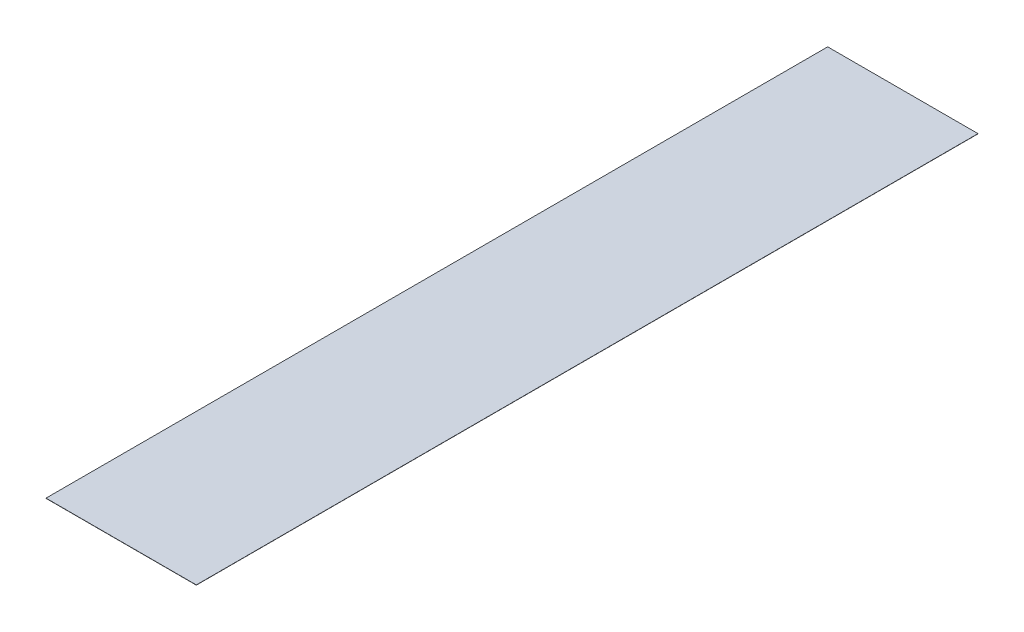
ISO-10303-21;
HEADER;
FILE_DESCRIPTION(('STEP AP214'),'2;1');
FILE_NAME('part.step','',(''),(''),'','','');
FILE_SCHEMA(('AUTOMOTIVE_DESIGN { 1 0 10303 214 1 1 1 1 }'));
ENDSEC;
DATA;
#1=APPLICATION_CONTEXT('core data for automotive mechanical design processes');
#2=APPLICATION_PROTOCOL_DEFINITION('international standard','automotive_design',2000,#1);
#3=PRODUCT_CONTEXT('',#1,'mechanical');
#4=PRODUCT('Part','Part','',(#3));
#5=PRODUCT_RELATED_PRODUCT_CATEGORY('part','',(#4));
#6=PRODUCT_DEFINITION_FORMATION('','',#4);
#7=PRODUCT_DEFINITION_CONTEXT('part definition',#1,'design');
#8=PRODUCT_DEFINITION('design','',#6,#7);
#9=PRODUCT_DEFINITION_SHAPE('','',#8);
#10=(LENGTH_UNIT() NAMED_UNIT(*) SI_UNIT(.MILLI.,.METRE.));
#11=(NAMED_UNIT(*) PLANE_ANGLE_UNIT() SI_UNIT($,.RADIAN.));
#12=(NAMED_UNIT(*) SI_UNIT($,.STERADIAN.) SOLID_ANGLE_UNIT());
#13=UNCERTAINTY_MEASURE_WITH_UNIT(LENGTH_MEASURE(1.E-05),#10,'distance_accuracy_value','');
#14=(GEOMETRIC_REPRESENTATION_CONTEXT(3) GLOBAL_UNCERTAINTY_ASSIGNED_CONTEXT((#13)) GLOBAL_UNIT_ASSIGNED_CONTEXT((#10,
#11,#12)) REPRESENTATION_CONTEXT('',''));
#15=CARTESIAN_POINT('',(0.,0.,0.));
#16=DIRECTION('',(0.,0.,1.));
#17=DIRECTION('',(1.,0.,0.));
#18=AXIS2_PLACEMENT_3D('',#15,#16,#17);
#19=CARTESIAN_POINT('',(0.,6.35,0.));
#20=DIRECTION('',(0.,1.,0.));
#21=DIRECTION('',(0.,0.,1.));
#22=AXIS2_PLACEMENT_3D('',#19,#20,#21);
#23=PLANE('',#22);
#24=DIRECTION('',(-1.,0.,0.));
#25=VECTOR('',#24,1.);
#26=CARTESIAN_POINT('',(2286.,6.35,-11887.2));
#27=LINE('',#26,#25);
#28=CARTESIAN_POINT('',(-2286.,6.35,-11887.2));
#29=VERTEX_POINT('',#28);
#30=CARTESIAN_POINT('',(2286.,6.35,-11887.2));
#31=VERTEX_POINT('',#30);
#32=EDGE_CURVE('E66',#29,#31,#27,.F.);
#33=ORIENTED_EDGE('',*,*,#32,.F.);
#34=DIRECTION('',(0.,0.,1.));
#35=VECTOR('',#34,1.);
#36=CARTESIAN_POINT('',(-2286.,6.35,-11887.2));
#37=LINE('',#36,#35);
#38=CARTESIAN_POINT('',(-2286.,6.35,11887.2));
#39=VERTEX_POINT('',#38);
#40=EDGE_CURVE('E18',#39,#29,#37,.F.);
#41=ORIENTED_EDGE('',*,*,#40,.F.);
#42=DIRECTION('',(1.,0.,0.));
#43=VECTOR('',#42,1.);
#44=CARTESIAN_POINT('',(-2286.,6.35,11887.2));
#45=LINE('',#44,#43);
#46=CARTESIAN_POINT('',(2286.,6.35,11887.2));
#47=VERTEX_POINT('',#46);
#48=EDGE_CURVE('E56',#47,#39,#45,.F.);
#49=ORIENTED_EDGE('',*,*,#48,.F.);
#50=DIRECTION('',(0.,0.,-1.));
#51=VECTOR('',#50,1.);
#52=CARTESIAN_POINT('',(2286.,6.35,11887.2));
#53=LINE('',#52,#51);
#54=EDGE_CURVE('E51',#31,#47,#53,.F.);
#55=ORIENTED_EDGE('',*,*,#54,.F.);
#56=EDGE_LOOP('',(#33,#41,#49,#55));
#57=FACE_BOUND('',#56,.T.);
#58=ADVANCED_FACE('F15',(#57),#23,.T.);
#59=CARTESIAN_POINT('',(-2286.,0.,-11887.2));
#60=DIRECTION('',(-1.,0.,0.));
#61=DIRECTION('',(0.,0.,1.));
#62=AXIS2_PLACEMENT_3D('',#59,#60,#61);
#63=PLANE('',#62);
#64=DIRECTION('',(0.,1.,0.));
#65=VECTOR('',#64,1.);
#66=CARTESIAN_POINT('',(-2286.,0.,-11887.2));
#67=LINE('',#66,#65);
#68=CARTESIAN_POINT('',(-2286.,0.,-11887.2));
#69=VERTEX_POINT('',#68);
#70=EDGE_CURVE('E77',#69,#29,#67,.T.);
#71=ORIENTED_EDGE('',*,*,#70,.F.);
#72=DIRECTION('',(0.,0.,1.));
#73=VECTOR('',#72,1.);
#74=CARTESIAN_POINT('',(-2286.,0.,0.));
#75=LINE('',#74,#73);
#76=CARTESIAN_POINT('',(-2286.,0.,11887.2));
#77=VERTEX_POINT('',#76);
#78=EDGE_CURVE('E72',#69,#77,#75,.T.);
#79=ORIENTED_EDGE('',*,*,#78,.T.);
#80=DIRECTION('',(0.,1.,0.));
#81=VECTOR('',#80,1.);
#82=CARTESIAN_POINT('',(-2286.,0.,11887.2));
#83=LINE('',#82,#81);
#84=EDGE_CURVE('E61',#39,#77,#83,.F.);
#85=ORIENTED_EDGE('',*,*,#84,.F.);
#86=ORIENTED_EDGE('',*,*,#40,.T.);
#87=EDGE_LOOP('',(#71,#79,#85,#86));
#88=FACE_BOUND('',#87,.T.);
#89=ADVANCED_FACE('F71',(#88),#63,.T.);
#90=CARTESIAN_POINT('',(-2286.,0.,11887.2));
#91=DIRECTION('',(0.,0.,1.));
#92=DIRECTION('',(1.,0.,0.));
#93=AXIS2_PLACEMENT_3D('',#90,#91,#92);
#94=PLANE('',#93);
#95=ORIENTED_EDGE('',*,*,#84,.T.);
#96=DIRECTION('',(1.,0.,0.));
#97=VECTOR('',#96,1.);
#98=CARTESIAN_POINT('',(0.,0.,11887.2));
#99=LINE('',#98,#97);
#100=CARTESIAN_POINT('',(2286.,0.,11887.2));
#101=VERTEX_POINT('',#100);
#102=EDGE_CURVE('E82',#77,#101,#99,.T.);
#103=ORIENTED_EDGE('',*,*,#102,.T.);
#104=DIRECTION('',(0.,1.,0.));
#105=VECTOR('',#104,1.);
#106=CARTESIAN_POINT('',(2286.,0.,11887.2));
#107=LINE('',#106,#105);
#108=EDGE_CURVE('E63',#47,#101,#107,.F.);
#109=ORIENTED_EDGE('',*,*,#108,.F.);
#110=ORIENTED_EDGE('',*,*,#48,.T.);
#111=EDGE_LOOP('',(#95,#103,#109,#110));
#112=FACE_BOUND('',#111,.T.);
#113=ADVANCED_FACE('F58',(#112),#94,.T.);
#114=CARTESIAN_POINT('',(2286.,0.,11887.2));
#115=DIRECTION('',(1.,0.,0.));
#116=DIRECTION('',(0.,0.,-1.));
#117=AXIS2_PLACEMENT_3D('',#114,#115,#116);
#118=PLANE('',#117);
#119=ORIENTED_EDGE('',*,*,#108,.T.);
#120=DIRECTION('',(0.,0.,1.));
#121=VECTOR('',#120,1.);
#122=CARTESIAN_POINT('',(2286.,0.,0.));
#123=LINE('',#122,#121);
#124=CARTESIAN_POINT('',(2286.,0.,-11887.2));
#125=VERTEX_POINT('',#124);
#126=EDGE_CURVE('E24',#101,#125,#123,.F.);
#127=ORIENTED_EDGE('',*,*,#126,.T.);
#128=DIRECTION('',(0.,1.,0.));
#129=VECTOR('',#128,1.);
#130=CARTESIAN_POINT('',(2286.,0.,-11887.2));
#131=LINE('',#130,#129);
#132=EDGE_CURVE('E32',#31,#125,#131,.F.);
#133=ORIENTED_EDGE('',*,*,#132,.F.);
#134=ORIENTED_EDGE('',*,*,#54,.T.);
#135=EDGE_LOOP('',(#119,#127,#133,#134));
#136=FACE_BOUND('',#135,.T.);
#137=ADVANCED_FACE('F86',(#136),#118,.T.);
#138=CARTESIAN_POINT('',(2286.,0.,-11887.2));
#139=DIRECTION('',(0.,0.,-1.));
#140=DIRECTION('',(-1.,0.,0.));
#141=AXIS2_PLACEMENT_3D('',#138,#139,#140);
#142=PLANE('',#141);
#143=ORIENTED_EDGE('',*,*,#132,.T.);
#144=DIRECTION('',(1.,0.,0.));
#145=VECTOR('',#144,1.);
#146=CARTESIAN_POINT('',(0.,0.,-11887.2));
#147=LINE('',#146,#145);
#148=EDGE_CURVE('E10',#125,#69,#147,.F.);
#149=ORIENTED_EDGE('',*,*,#148,.T.);
#150=ORIENTED_EDGE('',*,*,#70,.T.);
#151=ORIENTED_EDGE('',*,*,#32,.T.);
#152=EDGE_LOOP('',(#143,#149,#150,#151));
#153=FACE_BOUND('',#152,.T.);
#154=ADVANCED_FACE('F89',(#153),#142,.T.);
#155=CARTESIAN_POINT('',(0.,0.,0.));
#156=DIRECTION('',(0.,1.,0.));
#157=DIRECTION('',(0.,0.,1.));
#158=AXIS2_PLACEMENT_3D('',#155,#156,#157);
#159=PLANE('',#158);
#160=ORIENTED_EDGE('',*,*,#126,.F.);
#161=ORIENTED_EDGE('',*,*,#102,.F.);
#162=ORIENTED_EDGE('',*,*,#78,.F.);
#163=ORIENTED_EDGE('',*,*,#148,.F.);
#164=EDGE_LOOP('',(#160,#161,#162,#163));
#165=FACE_BOUND('',#164,.T.);
#166=ADVANCED_FACE('F88',(#165),#159,.F.);
#167=CLOSED_SHELL('',(#58,#89,#113,#137,#154,#166));
#168=MANIFOLD_SOLID_BREP('B1',#167);
#169=ADVANCED_BREP_SHAPE_REPRESENTATION('',(#18,#168),#14);
#170=SHAPE_DEFINITION_REPRESENTATION(#9,#169);
ENDSEC;
END-ISO-10303-21;
